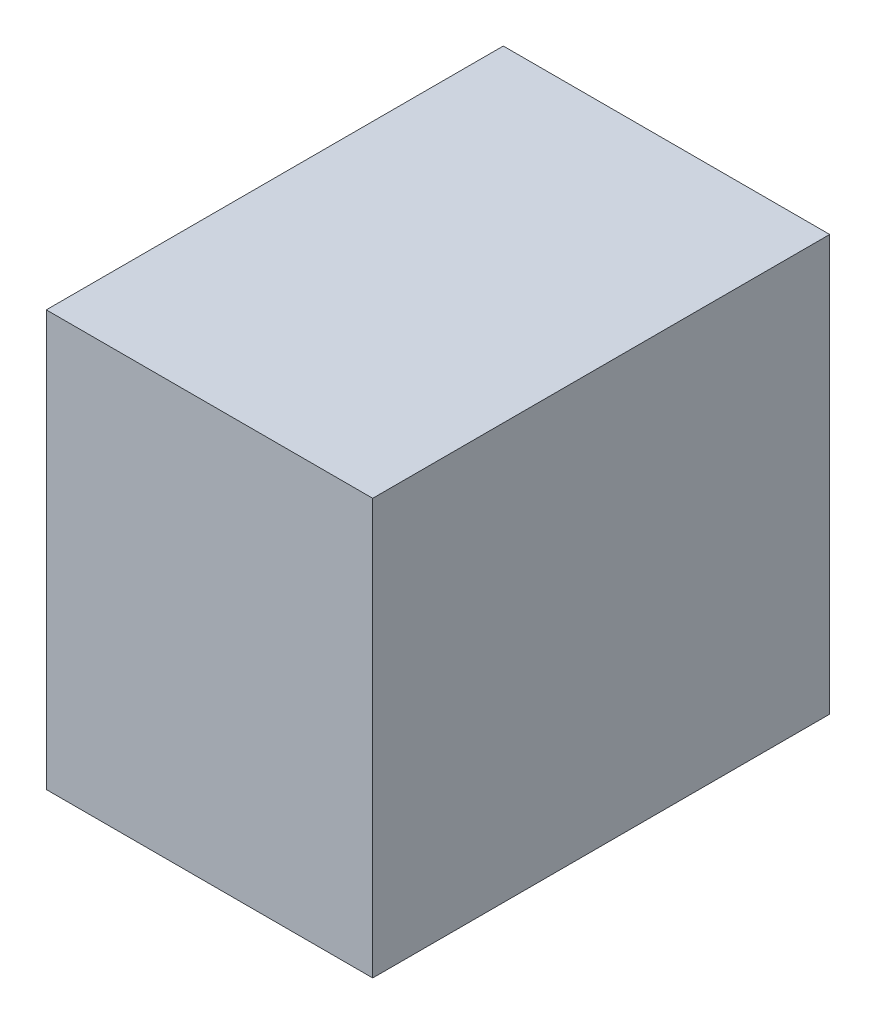
ISO-10303-21;
HEADER;
FILE_DESCRIPTION(('STEP AP214'),'2;1');
FILE_NAME('part.step','',(''),(''),'','','');
FILE_SCHEMA(('AUTOMOTIVE_DESIGN { 1 0 10303 214 1 1 1 1 }'));
ENDSEC;
DATA;
#1=APPLICATION_CONTEXT('core data for automotive mechanical design processes');
#2=APPLICATION_PROTOCOL_DEFINITION('international standard','automotive_design',2000,#1);
#3=PRODUCT_CONTEXT('',#1,'mechanical');
#4=PRODUCT('Part','Part','',(#3));
#5=PRODUCT_RELATED_PRODUCT_CATEGORY('part','',(#4));
#6=PRODUCT_DEFINITION_FORMATION('','',#4);
#7=PRODUCT_DEFINITION_CONTEXT('part definition',#1,'design');
#8=PRODUCT_DEFINITION('design','',#6,#7);
#9=PRODUCT_DEFINITION_SHAPE('','',#8);
#10=(LENGTH_UNIT() NAMED_UNIT(*) SI_UNIT(.MILLI.,.METRE.));
#11=(NAMED_UNIT(*) PLANE_ANGLE_UNIT() SI_UNIT($,.RADIAN.));
#12=(NAMED_UNIT(*) SI_UNIT($,.STERADIAN.) SOLID_ANGLE_UNIT());
#13=UNCERTAINTY_MEASURE_WITH_UNIT(LENGTH_MEASURE(1.E-05),#10,'distance_accuracy_value','');
#14=(GEOMETRIC_REPRESENTATION_CONTEXT(3) GLOBAL_UNCERTAINTY_ASSIGNED_CONTEXT((#13)) GLOBAL_UNIT_ASSIGNED_CONTEXT((#10,
#11,#12)) REPRESENTATION_CONTEXT('',''));
#15=CARTESIAN_POINT('',(0.,0.,0.));
#16=DIRECTION('',(0.,0.,1.));
#17=DIRECTION('',(1.,0.,0.));
#18=AXIS2_PLACEMENT_3D('',#15,#16,#17);
#19=CARTESIAN_POINT('',(55.,35.,-38.5));
#20=DIRECTION('',(0.,0.,1.));
#21=DIRECTION('',(1.,0.,0.));
#22=AXIS2_PLACEMENT_3D('',#19,#20,#21);
#23=PLANE('',#22);
#24=DIRECTION('',(0.,1.,0.));
#25=VECTOR('',#24,1.);
#26=CARTESIAN_POINT('',(0.,35.,-38.5));
#27=LINE('',#26,#25);
#28=CARTESIAN_POINT('',(0.,-35.,-38.5));
#29=VERTEX_POINT('',#28);
#30=CARTESIAN_POINT('',(0.,35.,-38.5));
#31=VERTEX_POINT('',#30);
#32=EDGE_CURVE('E177',#29,#31,#27,.T.);
#33=ORIENTED_EDGE('',*,*,#32,.T.);
#34=DIRECTION('',(-1.,0.,0.));
#35=VECTOR('',#34,1.);
#36=CARTESIAN_POINT('',(55.,35.,-38.5));
#37=LINE('',#36,#35);
#38=CARTESIAN_POINT('',(55.,35.,-38.5));
#39=VERTEX_POINT('',#38);
#40=EDGE_CURVE('E11',#39,#31,#37,.T.);
#41=ORIENTED_EDGE('',*,*,#40,.F.);
#42=DIRECTION('',(0.,1.,0.));
#43=VECTOR('',#42,1.);
#44=CARTESIAN_POINT('',(55.,35.,-38.5));
#45=LINE('',#44,#43);
#46=CARTESIAN_POINT('',(55.,-35.,-38.5));
#47=VERTEX_POINT('',#46);
#48=EDGE_CURVE('E183',#47,#39,#45,.T.);
#49=ORIENTED_EDGE('',*,*,#48,.F.);
#50=DIRECTION('',(-1.,0.,0.));
#51=VECTOR('',#50,1.);
#52=CARTESIAN_POINT('',(55.,-35.,-38.5));
#53=LINE('',#52,#51);
#54=EDGE_CURVE('E192',#47,#29,#53,.T.);
#55=ORIENTED_EDGE('',*,*,#54,.T.);
#56=EDGE_LOOP('',(#33,#41,#49,#55));
#57=FACE_BOUND('',#56,.T.);
#58=ADVANCED_FACE('F51',(#57),#23,.F.);
#59=CARTESIAN_POINT('',(55.,35.,38.5));
#60=DIRECTION('',(0.,-1.,0.));
#61=DIRECTION('',(0.,0.,-1.));
#62=AXIS2_PLACEMENT_3D('',#59,#60,#61);
#63=PLANE('',#62);
#64=DIRECTION('',(0.,0.,1.));
#65=VECTOR('',#64,1.);
#66=CARTESIAN_POINT('',(0.,35.,38.5));
#67=LINE('',#66,#65);
#68=CARTESIAN_POINT('',(0.,35.,38.5));
#69=VERTEX_POINT('',#68);
#70=EDGE_CURVE('E196',#31,#69,#67,.T.);
#71=ORIENTED_EDGE('',*,*,#70,.T.);
#72=DIRECTION('',(-1.,0.,0.));
#73=VECTOR('',#72,1.);
#74=CARTESIAN_POINT('',(55.,35.,38.5));
#75=LINE('',#74,#73);
#76=CARTESIAN_POINT('',(55.,35.,38.5));
#77=VERTEX_POINT('',#76);
#78=EDGE_CURVE('E60',#77,#69,#75,.T.);
#79=ORIENTED_EDGE('',*,*,#78,.F.);
#80=DIRECTION('',(0.,0.,1.));
#81=VECTOR('',#80,1.);
#82=CARTESIAN_POINT('',(55.,35.,38.5));
#83=LINE('',#82,#81);
#84=EDGE_CURVE('E99',#39,#77,#83,.T.);
#85=ORIENTED_EDGE('',*,*,#84,.F.);
#86=ORIENTED_EDGE('',*,*,#40,.T.);
#87=EDGE_LOOP('',(#71,#79,#85,#86));
#88=FACE_BOUND('',#87,.T.);
#89=ADVANCED_FACE('F225',(#88),#63,.F.);
#90=CARTESIAN_POINT('',(55.,35.,38.5));
#91=DIRECTION('',(0.,0.,-1.));
#92=DIRECTION('',(0.,1.,0.));
#93=AXIS2_PLACEMENT_3D('',#90,#91,#92);
#94=PLANE('',#93);
#95=DIRECTION('',(0.,-1.,0.));
#96=VECTOR('',#95,1.);
#97=CARTESIAN_POINT('',(0.,35.,38.5));
#98=LINE('',#97,#96);
#99=CARTESIAN_POINT('',(0.,-35.,38.5));
#100=VERTEX_POINT('',#99);
#101=EDGE_CURVE('E86',#69,#100,#98,.T.);
#102=ORIENTED_EDGE('',*,*,#101,.T.);
#103=DIRECTION('',(-1.,0.,0.));
#104=VECTOR('',#103,1.);
#105=CARTESIAN_POINT('',(55.,-35.,38.5));
#106=LINE('',#105,#104);
#107=CARTESIAN_POINT('',(55.,-35.,38.5));
#108=VERTEX_POINT('',#107);
#109=EDGE_CURVE('E205',#108,#100,#106,.T.);
#110=ORIENTED_EDGE('',*,*,#109,.F.);
#111=DIRECTION('',(0.,-1.,0.));
#112=VECTOR('',#111,1.);
#113=CARTESIAN_POINT('',(55.,35.,38.5));
#114=LINE('',#113,#112);
#115=EDGE_CURVE('E187',#77,#108,#114,.T.);
#116=ORIENTED_EDGE('',*,*,#115,.F.);
#117=ORIENTED_EDGE('',*,*,#78,.T.);
#118=EDGE_LOOP('',(#102,#110,#116,#117));
#119=FACE_BOUND('',#118,.T.);
#120=ADVANCED_FACE('F210',(#119),#94,.F.);
#121=CARTESIAN_POINT('',(55.,-35.,38.5));
#122=DIRECTION('',(0.,1.,0.));
#123=DIRECTION('',(0.,0.,1.));
#124=AXIS2_PLACEMENT_3D('',#121,#122,#123);
#125=PLANE('',#124);
#126=DIRECTION('',(0.,0.,-1.));
#127=VECTOR('',#126,1.);
#128=CARTESIAN_POINT('',(0.,-35.,38.5));
#129=LINE('',#128,#127);
#130=EDGE_CURVE('E92',#100,#29,#129,.T.);
#131=ORIENTED_EDGE('',*,*,#130,.T.);
#132=ORIENTED_EDGE('',*,*,#54,.F.);
#133=DIRECTION('',(0.,0.,-1.));
#134=VECTOR('',#133,1.);
#135=CARTESIAN_POINT('',(55.,-35.,38.5));
#136=LINE('',#135,#134);
#137=EDGE_CURVE('E68',#108,#47,#136,.T.);
#138=ORIENTED_EDGE('',*,*,#137,.F.);
#139=ORIENTED_EDGE('',*,*,#109,.T.);
#140=EDGE_LOOP('',(#131,#132,#138,#139));
#141=FACE_BOUND('',#140,.T.);
#142=ADVANCED_FACE('F217',(#141),#125,.F.);
#143=CARTESIAN_POINT('',(55.,0.,0.));
#144=DIRECTION('',(1.,0.,0.));
#145=DIRECTION('',(0.,0.,-1.));
#146=AXIS2_PLACEMENT_3D('',#143,#144,#145);
#147=PLANE('',#146);
#148=ORIENTED_EDGE('',*,*,#48,.T.);
#149=ORIENTED_EDGE('',*,*,#84,.T.);
#150=ORIENTED_EDGE('',*,*,#115,.T.);
#151=ORIENTED_EDGE('',*,*,#137,.T.);
#152=EDGE_LOOP('',(#148,#149,#150,#151));
#153=FACE_BOUND('',#152,.T.);
#154=ADVANCED_FACE('F219',(#153),#147,.T.);
#155=CARTESIAN_POINT('',(0.,0.,0.));
#156=DIRECTION('',(1.,0.,0.));
#157=DIRECTION('',(0.,0.,-1.));
#158=AXIS2_PLACEMENT_3D('',#155,#156,#157);
#159=PLANE('',#158);
#160=ORIENTED_EDGE('',*,*,#32,.F.);
#161=ORIENTED_EDGE('',*,*,#130,.F.);
#162=ORIENTED_EDGE('',*,*,#101,.F.);
#163=ORIENTED_EDGE('',*,*,#70,.F.);
#164=EDGE_LOOP('',(#160,#161,#162,#163));
#165=FACE_BOUND('',#164,.T.);
#166=ADVANCED_FACE('F213',(#165),#159,.F.);
#167=CLOSED_SHELL('',(#58,#89,#120,#142,#154,#166));
#168=CARTESIAN_POINT('',(10.,25.,-28.5));
#169=DIRECTION('',(-1.,0.,0.));
#170=DIRECTION('',(0.,-1.,0.));
#171=AXIS2_PLACEMENT_3D('',#168,#169,#170);
#172=PLANE('',#171);
#173=DIRECTION('',(0.,-1.,0.));
#174=VECTOR('',#173,1.);
#175=CARTESIAN_POINT('',(10.,25.,28.5));
#176=LINE('',#175,#174);
#177=CARTESIAN_POINT('',(10.,25.,28.5));
#178=VERTEX_POINT('',#177);
#179=CARTESIAN_POINT('',(10.,-25.,28.5));
#180=VERTEX_POINT('',#179);
#181=EDGE_CURVE('E133',#178,#180,#176,.T.);
#182=ORIENTED_EDGE('',*,*,#181,.T.);
#183=DIRECTION('',(0.,0.,1.));
#184=VECTOR('',#183,1.);
#185=CARTESIAN_POINT('',(10.,-25.,-28.5));
#186=LINE('',#185,#184);
#187=CARTESIAN_POINT('',(10.,-25.,-28.5));
#188=VERTEX_POINT('',#187);
#189=EDGE_CURVE('E126',#188,#180,#186,.T.);
#190=ORIENTED_EDGE('',*,*,#189,.F.);
#191=DIRECTION('',(0.,-1.,0.));
#192=VECTOR('',#191,1.);
#193=CARTESIAN_POINT('',(10.,25.,-28.5));
#194=LINE('',#193,#192);
#195=CARTESIAN_POINT('',(10.,25.,-28.5));
#196=VERTEX_POINT('',#195);
#197=EDGE_CURVE('E130',#196,#188,#194,.T.);
#198=ORIENTED_EDGE('',*,*,#197,.F.);
#199=DIRECTION('',(0.,0.,1.));
#200=VECTOR('',#199,1.);
#201=CARTESIAN_POINT('',(10.,25.,-28.5));
#202=LINE('',#201,#200);
#203=EDGE_CURVE('E174',#196,#178,#202,.T.);
#204=ORIENTED_EDGE('',*,*,#203,.T.);
#205=EDGE_LOOP('',(#182,#190,#198,#204));
#206=FACE_BOUND('',#205,.T.);
#207=ADVANCED_FACE('F128',(#206),#172,.F.);
#208=CARTESIAN_POINT('',(10.,25.,-28.5));
#209=DIRECTION('',(0.,1.,0.));
#210=DIRECTION('',(0.,0.,1.));
#211=AXIS2_PLACEMENT_3D('',#208,#209,#210);
#212=PLANE('',#211);
#213=DIRECTION('',(-1.,0.,0.));
#214=VECTOR('',#213,1.);
#215=CARTESIAN_POINT('',(10.,25.,28.5));
#216=LINE('',#215,#214);
#217=CARTESIAN_POINT('',(45.,25.,28.5));
#218=VERTEX_POINT('',#217);
#219=EDGE_CURVE('E153',#218,#178,#216,.T.);
#220=ORIENTED_EDGE('',*,*,#219,.T.);
#221=ORIENTED_EDGE('',*,*,#203,.F.);
#222=DIRECTION('',(-1.,0.,0.));
#223=VECTOR('',#222,1.);
#224=CARTESIAN_POINT('',(10.,25.,-28.5));
#225=LINE('',#224,#223);
#226=CARTESIAN_POINT('',(45.,25.,-28.5));
#227=VERTEX_POINT('',#226);
#228=EDGE_CURVE('E139',#227,#196,#225,.T.);
#229=ORIENTED_EDGE('',*,*,#228,.F.);
#230=DIRECTION('',(0.,0.,1.));
#231=VECTOR('',#230,1.);
#232=CARTESIAN_POINT('',(45.,25.,-28.5));
#233=LINE('',#232,#231);
#234=EDGE_CURVE('E178',#227,#218,#233,.T.);
#235=ORIENTED_EDGE('',*,*,#234,.T.);
#236=EDGE_LOOP('',(#220,#221,#229,#235));
#237=FACE_BOUND('',#236,.T.);
#238=ADVANCED_FACE('F263',(#237),#212,.F.);
#239=CARTESIAN_POINT('',(45.,25.,-28.5));
#240=DIRECTION('',(1.,0.,0.));
#241=DIRECTION('',(0.,0.,-1.));
#242=AXIS2_PLACEMENT_3D('',#239,#240,#241);
#243=PLANE('',#242);
#244=DIRECTION('',(0.,1.,0.));
#245=VECTOR('',#244,1.);
#246=CARTESIAN_POINT('',(45.,25.,28.5));
#247=LINE('',#246,#245);
#248=CARTESIAN_POINT('',(45.,-25.,28.5));
#249=VERTEX_POINT('',#248);
#250=EDGE_CURVE('E160',#249,#218,#247,.T.);
#251=ORIENTED_EDGE('',*,*,#250,.T.);
#252=ORIENTED_EDGE('',*,*,#234,.F.);
#253=DIRECTION('',(0.,1.,0.));
#254=VECTOR('',#253,1.);
#255=CARTESIAN_POINT('',(45.,25.,-28.5));
#256=LINE('',#255,#254);
#257=CARTESIAN_POINT('',(45.,-25.,-28.5));
#258=VERTEX_POINT('',#257);
#259=EDGE_CURVE('E148',#258,#227,#256,.T.);
#260=ORIENTED_EDGE('',*,*,#259,.F.);
#261=DIRECTION('',(0.,0.,1.));
#262=VECTOR('',#261,1.);
#263=CARTESIAN_POINT('',(45.,-25.,-28.5));
#264=LINE('',#263,#262);
#265=EDGE_CURVE('E138',#258,#249,#264,.T.);
#266=ORIENTED_EDGE('',*,*,#265,.T.);
#267=EDGE_LOOP('',(#251,#252,#260,#266));
#268=FACE_BOUND('',#267,.T.);
#269=ADVANCED_FACE('F273',(#268),#243,.F.);
#270=CARTESIAN_POINT('',(10.,-25.,-28.5));
#271=DIRECTION('',(0.,-1.,0.));
#272=DIRECTION('',(0.,0.,-1.));
#273=AXIS2_PLACEMENT_3D('',#270,#271,#272);
#274=PLANE('',#273);
#275=DIRECTION('',(1.,0.,0.));
#276=VECTOR('',#275,1.);
#277=CARTESIAN_POINT('',(10.,-25.,28.5));
#278=LINE('',#277,#276);
#279=EDGE_CURVE('E169',#180,#249,#278,.T.);
#280=ORIENTED_EDGE('',*,*,#279,.T.);
#281=ORIENTED_EDGE('',*,*,#265,.F.);
#282=DIRECTION('',(1.,0.,0.));
#283=VECTOR('',#282,1.);
#284=CARTESIAN_POINT('',(10.,-25.,-28.5));
#285=LINE('',#284,#283);
#286=EDGE_CURVE('E142',#188,#258,#285,.T.);
#287=ORIENTED_EDGE('',*,*,#286,.F.);
#288=ORIENTED_EDGE('',*,*,#189,.T.);
#289=EDGE_LOOP('',(#280,#281,#287,#288));
#290=FACE_BOUND('',#289,.T.);
#291=ADVANCED_FACE('F143',(#290),#274,.F.);
#292=CARTESIAN_POINT('',(0.,0.,-28.5));
#293=DIRECTION('',(0.,0.,1.));
#294=DIRECTION('',(1.,0.,0.));
#295=AXIS2_PLACEMENT_3D('',#292,#293,#294);
#296=PLANE('',#295);
#297=ORIENTED_EDGE('',*,*,#197,.T.);
#298=ORIENTED_EDGE('',*,*,#286,.T.);
#299=ORIENTED_EDGE('',*,*,#259,.T.);
#300=ORIENTED_EDGE('',*,*,#228,.T.);
#301=EDGE_LOOP('',(#297,#298,#299,#300));
#302=FACE_BOUND('',#301,.T.);
#303=ADVANCED_FACE('F150',(#302),#296,.T.);
#304=CARTESIAN_POINT('',(0.,0.,28.5));
#305=DIRECTION('',(0.,0.,1.));
#306=DIRECTION('',(1.,0.,0.));
#307=AXIS2_PLACEMENT_3D('',#304,#305,#306);
#308=PLANE('',#307);
#309=ORIENTED_EDGE('',*,*,#181,.F.);
#310=ORIENTED_EDGE('',*,*,#219,.F.);
#311=ORIENTED_EDGE('',*,*,#250,.F.);
#312=ORIENTED_EDGE('',*,*,#279,.F.);
#313=EDGE_LOOP('',(#309,#310,#311,#312));
#314=FACE_BOUND('',#313,.T.);
#315=ADVANCED_FACE('F300',(#314),#308,.F.);
#316=CLOSED_SHELL('',(#207,#238,#269,#291,#303,#315));
#317=ORIENTED_CLOSED_SHELL('',*,#316,.T.);
#318=BREP_WITH_VOIDS('B2',#167,(#317));
#319=ADVANCED_BREP_SHAPE_REPRESENTATION('',(#18,#318),#14);
#320=SHAPE_DEFINITION_REPRESENTATION(#9,#319);
ENDSEC;
END-ISO-10303-21;
